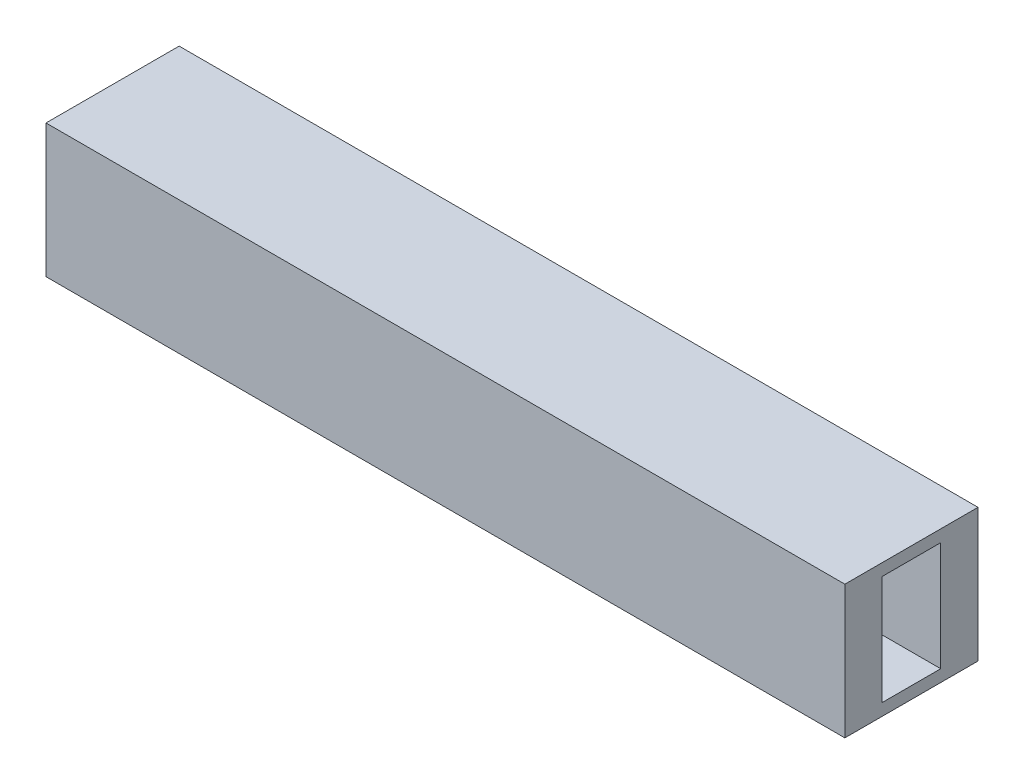
ISO-10303-21;
HEADER;
FILE_DESCRIPTION(('STEP AP214'),'2;1');
FILE_NAME('part.step','',(''),(''),'','','');
FILE_SCHEMA(('AUTOMOTIVE_DESIGN { 1 0 10303 214 1 1 1 1 }'));
ENDSEC;
DATA;
#1=APPLICATION_CONTEXT('core data for automotive mechanical design processes');
#2=APPLICATION_PROTOCOL_DEFINITION('international standard','automotive_design',2000,#1);
#3=PRODUCT_CONTEXT('',#1,'mechanical');
#4=PRODUCT('Part','Part','',(#3));
#5=PRODUCT_RELATED_PRODUCT_CATEGORY('part','',(#4));
#6=PRODUCT_DEFINITION_FORMATION('','',#4);
#7=PRODUCT_DEFINITION_CONTEXT('part definition',#1,'design');
#8=PRODUCT_DEFINITION('design','',#6,#7);
#9=PRODUCT_DEFINITION_SHAPE('','',#8);
#10=(LENGTH_UNIT() NAMED_UNIT(*) SI_UNIT(.MILLI.,.METRE.));
#11=(NAMED_UNIT(*) PLANE_ANGLE_UNIT() SI_UNIT($,.RADIAN.));
#12=(NAMED_UNIT(*) SI_UNIT($,.STERADIAN.) SOLID_ANGLE_UNIT());
#13=UNCERTAINTY_MEASURE_WITH_UNIT(LENGTH_MEASURE(1.E-05),#10,'distance_accuracy_value','');
#14=(GEOMETRIC_REPRESENTATION_CONTEXT(3) GLOBAL_UNCERTAINTY_ASSIGNED_CONTEXT((#13)) GLOBAL_UNIT_ASSIGNED_CONTEXT((#10,
#11,#12)) REPRESENTATION_CONTEXT('',''));
#15=CARTESIAN_POINT('',(0.,0.,0.));
#16=DIRECTION('',(0.,0.,1.));
#17=DIRECTION('',(1.,0.,0.));
#18=AXIS2_PLACEMENT_3D('',#15,#16,#17);
#19=CARTESIAN_POINT('',(300.,-25.,25.));
#20=DIRECTION('',(0.,0.,-1.));
#21=DIRECTION('',(-1.,0.,0.));
#22=AXIS2_PLACEMENT_3D('',#19,#20,#21);
#23=PLANE('',#22);
#24=DIRECTION('',(0.,-1.,0.));
#25=VECTOR('',#24,1.);
#26=CARTESIAN_POINT('',(0.,-25.,25.));
#27=LINE('',#26,#25);
#28=CARTESIAN_POINT('',(0.,25.,25.));
#29=VERTEX_POINT('',#28);
#30=CARTESIAN_POINT('',(0.,-25.,25.));
#31=VERTEX_POINT('',#30);
#32=EDGE_CURVE('E103',#29,#31,#27,.T.);
#33=ORIENTED_EDGE('',*,*,#32,.T.);
#34=DIRECTION('',(-1.,0.,0.));
#35=VECTOR('',#34,1.);
#36=CARTESIAN_POINT('',(300.,-25.,25.));
#37=LINE('',#36,#35);
#38=CARTESIAN_POINT('',(300.,-25.,25.));
#39=VERTEX_POINT('',#38);
#40=EDGE_CURVE('E11',#39,#31,#37,.T.);
#41=ORIENTED_EDGE('',*,*,#40,.F.);
#42=DIRECTION('',(0.,-1.,0.));
#43=VECTOR('',#42,1.);
#44=CARTESIAN_POINT('',(300.,-25.,25.));
#45=LINE('',#44,#43);
#46=CARTESIAN_POINT('',(300.,25.,25.));
#47=VERTEX_POINT('',#46);
#48=EDGE_CURVE('E132',#47,#39,#45,.T.);
#49=ORIENTED_EDGE('',*,*,#48,.F.);
#50=DIRECTION('',(-1.,0.,0.));
#51=VECTOR('',#50,1.);
#52=CARTESIAN_POINT('',(300.,25.,25.));
#53=LINE('',#52,#51);
#54=EDGE_CURVE('E142',#47,#29,#53,.T.);
#55=ORIENTED_EDGE('',*,*,#54,.T.);
#56=EDGE_LOOP('',(#33,#41,#49,#55));
#57=FACE_BOUND('',#56,.T.);
#58=ADVANCED_FACE('F33',(#57),#23,.F.);
#59=CARTESIAN_POINT('',(300.,-25.,-25.));
#60=DIRECTION('',(0.,1.,0.));
#61=DIRECTION('',(0.,0.,1.));
#62=AXIS2_PLACEMENT_3D('',#59,#60,#61);
#63=PLANE('',#62);
#64=DIRECTION('',(0.,0.,-1.));
#65=VECTOR('',#64,1.);
#66=CARTESIAN_POINT('',(0.,-25.,-25.));
#67=LINE('',#66,#65);
#68=CARTESIAN_POINT('',(0.,-25.,-25.));
#69=VERTEX_POINT('',#68);
#70=EDGE_CURVE('E145',#31,#69,#67,.T.);
#71=ORIENTED_EDGE('',*,*,#70,.T.);
#72=DIRECTION('',(-1.,0.,0.));
#73=VECTOR('',#72,1.);
#74=CARTESIAN_POINT('',(300.,-25.,-25.));
#75=LINE('',#74,#73);
#76=CARTESIAN_POINT('',(300.,-25.,-25.));
#77=VERTEX_POINT('',#76);
#78=EDGE_CURVE('E40',#77,#69,#75,.T.);
#79=ORIENTED_EDGE('',*,*,#78,.F.);
#80=DIRECTION('',(0.,0.,-1.));
#81=VECTOR('',#80,1.);
#82=CARTESIAN_POINT('',(300.,-25.,-25.));
#83=LINE('',#82,#81);
#84=EDGE_CURVE('E135',#39,#77,#83,.T.);
#85=ORIENTED_EDGE('',*,*,#84,.F.);
#86=ORIENTED_EDGE('',*,*,#40,.T.);
#87=EDGE_LOOP('',(#71,#79,#85,#86));
#88=FACE_BOUND('',#87,.T.);
#89=ADVANCED_FACE('F173',(#88),#63,.F.);
#90=CARTESIAN_POINT('',(300.,-25.,-25.));
#91=DIRECTION('',(0.,0.,1.));
#92=DIRECTION('',(1.,0.,0.));
#93=AXIS2_PLACEMENT_3D('',#90,#91,#92);
#94=PLANE('',#93);
#95=DIRECTION('',(0.,1.,0.));
#96=VECTOR('',#95,1.);
#97=CARTESIAN_POINT('',(0.,-25.,-25.));
#98=LINE('',#97,#96);
#99=CARTESIAN_POINT('',(0.,25.,-25.));
#100=VERTEX_POINT('',#99);
#101=EDGE_CURVE('E147',#69,#100,#98,.T.);
#102=ORIENTED_EDGE('',*,*,#101,.T.);
#103=DIRECTION('',(-1.,0.,0.));
#104=VECTOR('',#103,1.);
#105=CARTESIAN_POINT('',(300.,25.,-25.));
#106=LINE('',#105,#104);
#107=CARTESIAN_POINT('',(300.,25.,-25.));
#108=VERTEX_POINT('',#107);
#109=EDGE_CURVE('E152',#108,#100,#106,.T.);
#110=ORIENTED_EDGE('',*,*,#109,.F.);
#111=DIRECTION('',(0.,1.,0.));
#112=VECTOR('',#111,1.);
#113=CARTESIAN_POINT('',(300.,-25.,-25.));
#114=LINE('',#113,#112);
#115=EDGE_CURVE('E138',#77,#108,#114,.T.);
#116=ORIENTED_EDGE('',*,*,#115,.F.);
#117=ORIENTED_EDGE('',*,*,#78,.T.);
#118=EDGE_LOOP('',(#102,#110,#116,#117));
#119=FACE_BOUND('',#118,.T.);
#120=ADVANCED_FACE('F159',(#119),#94,.F.);
#121=CARTESIAN_POINT('',(300.,25.,-25.));
#122=DIRECTION('',(0.,-1.,0.));
#123=DIRECTION('',(0.,0.,-1.));
#124=AXIS2_PLACEMENT_3D('',#121,#122,#123);
#125=PLANE('',#124);
#126=DIRECTION('',(0.,0.,1.));
#127=VECTOR('',#126,1.);
#128=CARTESIAN_POINT('',(0.,25.,-25.));
#129=LINE('',#128,#127);
#130=EDGE_CURVE('E136',#100,#29,#129,.T.);
#131=ORIENTED_EDGE('',*,*,#130,.T.);
#132=ORIENTED_EDGE('',*,*,#54,.F.);
#133=DIRECTION('',(0.,0.,1.));
#134=VECTOR('',#133,1.);
#135=CARTESIAN_POINT('',(300.,25.,-25.));
#136=LINE('',#135,#134);
#137=EDGE_CURVE('E140',#108,#47,#136,.T.);
#138=ORIENTED_EDGE('',*,*,#137,.F.);
#139=ORIENTED_EDGE('',*,*,#109,.T.);
#140=EDGE_LOOP('',(#131,#132,#138,#139));
#141=FACE_BOUND('',#140,.T.);
#142=ADVANCED_FACE('F168',(#141),#125,.F.);
#143=CARTESIAN_POINT('',(300.,0.,0.));
#144=DIRECTION('',(1.,0.,0.));
#145=DIRECTION('',(0.,0.,-1.));
#146=AXIS2_PLACEMENT_3D('',#143,#144,#145);
#147=PLANE('',#146);
#148=DIRECTION('',(0.,1.,0.));
#149=VECTOR('',#148,1.);
#150=CARTESIAN_POINT('',(300.,-20.5,11.));
#151=LINE('',#150,#149);
#152=CARTESIAN_POINT('',(300.,-20.5,11.));
#153=VERTEX_POINT('',#152);
#154=CARTESIAN_POINT('',(300.,20.5,11.));
#155=VERTEX_POINT('',#154);
#156=EDGE_CURVE('E107',#153,#155,#151,.T.);
#157=ORIENTED_EDGE('',*,*,#156,.T.);
#158=DIRECTION('',(0.,0.,-1.));
#159=VECTOR('',#158,1.);
#160=CARTESIAN_POINT('',(300.,20.5,-11.));
#161=LINE('',#160,#159);
#162=CARTESIAN_POINT('',(300.,20.5,-11.));
#163=VERTEX_POINT('',#162);
#164=EDGE_CURVE('E96',#155,#163,#161,.T.);
#165=ORIENTED_EDGE('',*,*,#164,.T.);
#166=DIRECTION('',(0.,-1.,0.));
#167=VECTOR('',#166,1.);
#168=CARTESIAN_POINT('',(300.,-20.5,-11.));
#169=LINE('',#168,#167);
#170=CARTESIAN_POINT('',(300.,-20.5,-11.));
#171=VERTEX_POINT('',#170);
#172=EDGE_CURVE('E118',#163,#171,#169,.T.);
#173=ORIENTED_EDGE('',*,*,#172,.T.);
#174=DIRECTION('',(0.,0.,1.));
#175=VECTOR('',#174,1.);
#176=CARTESIAN_POINT('',(300.,-20.5,-11.));
#177=LINE('',#176,#175);
#178=EDGE_CURVE('E114',#171,#153,#177,.T.);
#179=ORIENTED_EDGE('',*,*,#178,.T.);
#180=EDGE_LOOP('',(#157,#165,#173,#179));
#181=FACE_BOUND('',#180,.T.);
#182=ORIENTED_EDGE('',*,*,#48,.T.);
#183=ORIENTED_EDGE('',*,*,#84,.T.);
#184=ORIENTED_EDGE('',*,*,#115,.T.);
#185=ORIENTED_EDGE('',*,*,#137,.T.);
#186=EDGE_LOOP('',(#182,#183,#184,#185));
#187=FACE_BOUND('',#186,.T.);
#188=ADVANCED_FACE('F112',(#181,#187),#147,.T.);
#189=CARTESIAN_POINT('',(0.,0.,0.));
#190=DIRECTION('',(1.,0.,0.));
#191=DIRECTION('',(0.,0.,-1.));
#192=AXIS2_PLACEMENT_3D('',#189,#190,#191);
#193=PLANE('',#192);
#194=DIRECTION('',(0.,0.,-1.));
#195=VECTOR('',#194,1.);
#196=CARTESIAN_POINT('',(0.,20.5,-11.));
#197=LINE('',#196,#195);
#198=CARTESIAN_POINT('',(0.,20.5,11.));
#199=VERTEX_POINT('',#198);
#200=CARTESIAN_POINT('',(0.,20.5,-11.));
#201=VERTEX_POINT('',#200);
#202=EDGE_CURVE('E116',#199,#201,#197,.T.);
#203=ORIENTED_EDGE('',*,*,#202,.F.);
#204=DIRECTION('',(0.,1.,0.));
#205=VECTOR('',#204,1.);
#206=CARTESIAN_POINT('',(0.,-20.5,11.));
#207=LINE('',#206,#205);
#208=CARTESIAN_POINT('',(0.,-20.5,11.));
#209=VERTEX_POINT('',#208);
#210=EDGE_CURVE('E55',#209,#199,#207,.T.);
#211=ORIENTED_EDGE('',*,*,#210,.F.);
#212=DIRECTION('',(0.,0.,1.));
#213=VECTOR('',#212,1.);
#214=CARTESIAN_POINT('',(0.,-20.5,-11.));
#215=LINE('',#214,#213);
#216=CARTESIAN_POINT('',(0.,-20.5,-11.));
#217=VERTEX_POINT('',#216);
#218=EDGE_CURVE('E109',#217,#209,#215,.T.);
#219=ORIENTED_EDGE('',*,*,#218,.F.);
#220=DIRECTION('',(0.,-1.,0.));
#221=VECTOR('',#220,1.);
#222=CARTESIAN_POINT('',(0.,-20.5,-11.));
#223=LINE('',#222,#221);
#224=EDGE_CURVE('E123',#201,#217,#223,.T.);
#225=ORIENTED_EDGE('',*,*,#224,.F.);
#226=EDGE_LOOP('',(#203,#211,#219,#225));
#227=FACE_BOUND('',#226,.T.);
#228=ORIENTED_EDGE('',*,*,#32,.F.);
#229=ORIENTED_EDGE('',*,*,#130,.F.);
#230=ORIENTED_EDGE('',*,*,#101,.F.);
#231=ORIENTED_EDGE('',*,*,#70,.F.);
#232=EDGE_LOOP('',(#228,#229,#230,#231));
#233=FACE_BOUND('',#232,.T.);
#234=ADVANCED_FACE('F165',(#227,#233),#193,.F.);
#235=CARTESIAN_POINT('',(300.001,-20.5,11.));
#236=DIRECTION('',(0.,0.,1.));
#237=DIRECTION('',(1.,0.,0.));
#238=AXIS2_PLACEMENT_3D('',#235,#236,#237);
#239=PLANE('',#238);
#240=DIRECTION('',(-1.,0.,0.));
#241=VECTOR('',#240,1.);
#242=CARTESIAN_POINT('',(300.001,-20.5,11.));
#243=LINE('',#242,#241);
#244=EDGE_CURVE('E104',#153,#209,#243,.T.);
#245=ORIENTED_EDGE('',*,*,#244,.T.);
#246=ORIENTED_EDGE('',*,*,#210,.T.);
#247=DIRECTION('',(-1.,0.,0.));
#248=VECTOR('',#247,1.);
#249=CARTESIAN_POINT('',(300.001,20.5,11.));
#250=LINE('',#249,#248);
#251=EDGE_CURVE('E98',#155,#199,#250,.T.);
#252=ORIENTED_EDGE('',*,*,#251,.F.);
#253=ORIENTED_EDGE('',*,*,#156,.F.);
#254=EDGE_LOOP('',(#245,#246,#252,#253));
#255=FACE_BOUND('',#254,.T.);
#256=ADVANCED_FACE('F106',(#255),#239,.F.);
#257=CARTESIAN_POINT('',(300.001,-20.5,-11.));
#258=DIRECTION('',(0.,-1.,0.));
#259=DIRECTION('',(0.,0.,-1.));
#260=AXIS2_PLACEMENT_3D('',#257,#258,#259);
#261=PLANE('',#260);
#262=DIRECTION('',(-1.,0.,0.));
#263=VECTOR('',#262,1.);
#264=CARTESIAN_POINT('',(300.001,-20.5,-11.));
#265=LINE('',#264,#263);
#266=EDGE_CURVE('E129',#171,#217,#265,.T.);
#267=ORIENTED_EDGE('',*,*,#266,.T.);
#268=ORIENTED_EDGE('',*,*,#218,.T.);
#269=ORIENTED_EDGE('',*,*,#244,.F.);
#270=ORIENTED_EDGE('',*,*,#178,.F.);
#271=EDGE_LOOP('',(#267,#268,#269,#270));
#272=FACE_BOUND('',#271,.T.);
#273=ADVANCED_FACE('F190',(#272),#261,.F.);
#274=CARTESIAN_POINT('',(300.001,-20.5,-11.));
#275=DIRECTION('',(0.,0.,-1.));
#276=DIRECTION('',(-1.,0.,0.));
#277=AXIS2_PLACEMENT_3D('',#274,#275,#276);
#278=PLANE('',#277);
#279=DIRECTION('',(-1.,0.,0.));
#280=VECTOR('',#279,1.);
#281=CARTESIAN_POINT('',(300.001,20.5,-11.));
#282=LINE('',#281,#280);
#283=EDGE_CURVE('E47',#163,#201,#282,.T.);
#284=ORIENTED_EDGE('',*,*,#283,.T.);
#285=ORIENTED_EDGE('',*,*,#224,.T.);
#286=ORIENTED_EDGE('',*,*,#266,.F.);
#287=ORIENTED_EDGE('',*,*,#172,.F.);
#288=EDGE_LOOP('',(#284,#285,#286,#287));
#289=FACE_BOUND('',#288,.T.);
#290=ADVANCED_FACE('F193',(#289),#278,.F.);
#291=CARTESIAN_POINT('',(300.001,20.5,-11.));
#292=DIRECTION('',(0.,1.,0.));
#293=DIRECTION('',(0.,0.,1.));
#294=AXIS2_PLACEMENT_3D('',#291,#292,#293);
#295=PLANE('',#294);
#296=ORIENTED_EDGE('',*,*,#251,.T.);
#297=ORIENTED_EDGE('',*,*,#202,.T.);
#298=ORIENTED_EDGE('',*,*,#283,.F.);
#299=ORIENTED_EDGE('',*,*,#164,.F.);
#300=EDGE_LOOP('',(#296,#297,#298,#299));
#301=FACE_BOUND('',#300,.T.);
#302=ADVANCED_FACE('F97',(#301),#295,.F.);
#303=CLOSED_SHELL('',(#58,#89,#120,#142,#188,#234,#256,#273,#290,#302));
#304=MANIFOLD_SOLID_BREP('B2',#303);
#305=ADVANCED_BREP_SHAPE_REPRESENTATION('',(#18,#304),#14);
#306=SHAPE_DEFINITION_REPRESENTATION(#9,#305);
ENDSEC;
END-ISO-10303-21;
